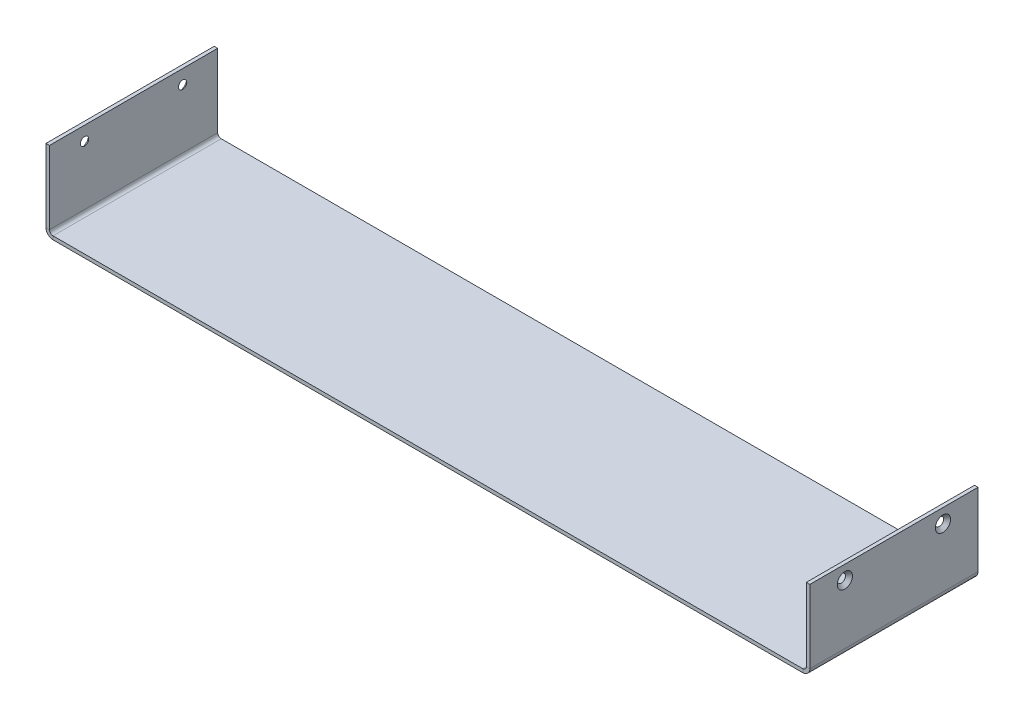
ISO-10303-21;
HEADER;
FILE_DESCRIPTION(('STEP AP214'),'2;1');
FILE_NAME('part.step','',(''),(''),'','','');
FILE_SCHEMA(('AUTOMOTIVE_DESIGN { 1 0 10303 214 1 1 1 1 }'));
ENDSEC;
DATA;
#1=APPLICATION_CONTEXT('core data for automotive mechanical design processes');
#2=APPLICATION_PROTOCOL_DEFINITION('international standard','automotive_design',2000,#1);
#3=PRODUCT_CONTEXT('',#1,'mechanical');
#4=PRODUCT('Part','Part','',(#3));
#5=PRODUCT_RELATED_PRODUCT_CATEGORY('part','',(#4));
#6=PRODUCT_DEFINITION_FORMATION('','',#4);
#7=PRODUCT_DEFINITION_CONTEXT('part definition',#1,'design');
#8=PRODUCT_DEFINITION('design','',#6,#7);
#9=PRODUCT_DEFINITION_SHAPE('','',#8);
#10=(LENGTH_UNIT() NAMED_UNIT(*) SI_UNIT(.MILLI.,.METRE.));
#11=(NAMED_UNIT(*) PLANE_ANGLE_UNIT() SI_UNIT($,.RADIAN.));
#12=(NAMED_UNIT(*) SI_UNIT($,.STERADIAN.) SOLID_ANGLE_UNIT());
#13=UNCERTAINTY_MEASURE_WITH_UNIT(LENGTH_MEASURE(1.E-05),#10,'distance_accuracy_value','');
#14=(GEOMETRIC_REPRESENTATION_CONTEXT(3) GLOBAL_UNCERTAINTY_ASSIGNED_CONTEXT((#13)) GLOBAL_UNIT_ASSIGNED_CONTEXT((#10,
#11,#12)) REPRESENTATION_CONTEXT('',''));
#15=CARTESIAN_POINT('',(0.,0.,0.));
#16=DIRECTION('',(0.,0.,1.));
#17=DIRECTION('',(1.,0.,0.));
#18=AXIS2_PLACEMENT_3D('',#15,#16,#17);
#19=CARTESIAN_POINT('',(0.,-41.7,96.));
#20=DIRECTION('',(0.,0.,1.));
#21=DIRECTION('',(1.,0.,0.));
#22=AXIS2_PLACEMENT_3D('',#19,#20,#21);
#23=PLANE('',#22);
#24=DIRECTION('',(1.,0.,0.));
#25=VECTOR('',#24,1.);
#26=CARTESIAN_POINT('',(0.,-41.7,96.));
#27=LINE('',#26,#25);
#28=CARTESIAN_POINT('',(0.,-41.7,96.));
#29=VERTEX_POINT('',#28);
#30=CARTESIAN_POINT('',(2.00000000000001,-41.7,96.));
#31=VERTEX_POINT('',#30);
#32=EDGE_CURVE('E150',#29,#31,#27,.T.);
#33=ORIENTED_EDGE('',*,*,#32,.F.);
#34=CARTESIAN_POINT('',(4.00000000000001,-41.7,96.));
#35=DIRECTION('',(0.,0.,-1.));
#36=DIRECTION('',(-1.,0.,0.));
#37=AXIS2_PLACEMENT_3D('',#34,#35,#36);
#38=CIRCLE('',#37,4.);
#39=CARTESIAN_POINT('',(4.00000000000001,-45.7,96.));
#40=VERTEX_POINT('',#39);
#41=EDGE_CURVE('E154',#29,#40,#38,.F.);
#42=ORIENTED_EDGE('',*,*,#41,.T.);
#43=DIRECTION('',(0.,-1.,0.));
#44=VECTOR('',#43,1.);
#45=CARTESIAN_POINT('',(4.00000000000001,-43.7,96.));
#46=LINE('',#45,#44);
#47=CARTESIAN_POINT('',(4.00000000000001,-43.7,96.));
#48=VERTEX_POINT('',#47);
#49=EDGE_CURVE('E138',#48,#40,#46,.T.);
#50=ORIENTED_EDGE('',*,*,#49,.F.);
#51=CARTESIAN_POINT('',(4.00000000000001,-41.7,96.));
#52=DIRECTION('',(0.,0.,1.));
#53=DIRECTION('',(1.,0.,0.));
#54=AXIS2_PLACEMENT_3D('',#51,#52,#53);
#55=CIRCLE('',#54,2.);
#56=EDGE_CURVE('E295',#31,#48,#55,.T.);
#57=ORIENTED_EDGE('',*,*,#56,.F.);
#58=EDGE_LOOP('',(#33,#42,#50,#57));
#59=FACE_BOUND('',#58,.T.);
#60=ADVANCED_FACE('F39',(#59),#23,.T.);
#61=CARTESIAN_POINT('',(4.00000000000001,-43.7,96.));
#62=DIRECTION('',(0.,0.,1.));
#63=DIRECTION('',(1.,0.,0.));
#64=AXIS2_PLACEMENT_3D('',#61,#62,#63);
#65=PLANE('',#64);
#66=DIRECTION('',(0.,-1.,0.));
#67=VECTOR('',#66,1.);
#68=CARTESIAN_POINT('',(0.,0.,96.));
#69=LINE('',#68,#67);
#70=CARTESIAN_POINT('',(0.,0.,96.));
#71=VERTEX_POINT('',#70);
#72=EDGE_CURVE('E159',#71,#29,#69,.T.);
#73=ORIENTED_EDGE('',*,*,#72,.T.);
#74=ORIENTED_EDGE('',*,*,#32,.T.);
#75=DIRECTION('',(0.,-1.,0.));
#76=VECTOR('',#75,1.);
#77=CARTESIAN_POINT('',(2.,0.,96.));
#78=LINE('',#77,#76);
#79=CARTESIAN_POINT('',(2.,0.,96.));
#80=VERTEX_POINT('',#79);
#81=EDGE_CURVE('E293',#80,#31,#78,.T.);
#82=ORIENTED_EDGE('',*,*,#81,.F.);
#83=DIRECTION('',(1.,0.,0.));
#84=VECTOR('',#83,1.);
#85=CARTESIAN_POINT('',(0.,0.,96.));
#86=LINE('',#85,#84);
#87=EDGE_CURVE('E291',#71,#80,#86,.T.);
#88=ORIENTED_EDGE('',*,*,#87,.F.);
#89=EDGE_LOOP('',(#73,#74,#82,#88));
#90=FACE_BOUND('',#89,.T.);
#91=ADVANCED_FACE('F328',(#90),#65,.T.);
#92=CARTESIAN_POINT('',(4.00000000000001,-45.7,0.));
#93=DIRECTION('',(0.,0.,-1.));
#94=DIRECTION('',(-1.,0.,0.));
#95=AXIS2_PLACEMENT_3D('',#92,#93,#94);
#96=PLANE('',#95);
#97=DIRECTION('',(0.,1.,0.));
#98=VECTOR('',#97,1.);
#99=CARTESIAN_POINT('',(4.00000000000001,-45.7,0.));
#100=LINE('',#99,#98);
#101=CARTESIAN_POINT('',(4.00000000000001,-45.7,0.));
#102=VERTEX_POINT('',#101);
#103=CARTESIAN_POINT('',(4.00000000000001,-43.7,0.));
#104=VERTEX_POINT('',#103);
#105=EDGE_CURVE('E151',#102,#104,#100,.T.);
#106=ORIENTED_EDGE('',*,*,#105,.F.);
#107=CARTESIAN_POINT('',(4.00000000000001,-41.7,0.));
#108=DIRECTION('',(0.,0.,-1.));
#109=DIRECTION('',(-1.,0.,0.));
#110=AXIS2_PLACEMENT_3D('',#107,#108,#109);
#111=CIRCLE('',#110,4.);
#112=CARTESIAN_POINT('',(0.,-41.7,0.));
#113=VERTEX_POINT('',#112);
#114=EDGE_CURVE('E166',#113,#102,#111,.F.);
#115=ORIENTED_EDGE('',*,*,#114,.F.);
#116=DIRECTION('',(-1.,0.,0.));
#117=VECTOR('',#116,1.);
#118=CARTESIAN_POINT('',(2.00000000000001,-41.7,0.));
#119=LINE('',#118,#117);
#120=CARTESIAN_POINT('',(2.00000000000001,-41.7,0.));
#121=VERTEX_POINT('',#120);
#122=EDGE_CURVE('E239',#121,#113,#119,.T.);
#123=ORIENTED_EDGE('',*,*,#122,.F.);
#124=CARTESIAN_POINT('',(4.00000000000001,-41.7,0.));
#125=DIRECTION('',(0.,0.,1.));
#126=DIRECTION('',(1.,0.,0.));
#127=AXIS2_PLACEMENT_3D('',#124,#125,#126);
#128=CIRCLE('',#127,2.);
#129=EDGE_CURVE('E193',#121,#104,#128,.T.);
#130=ORIENTED_EDGE('',*,*,#129,.T.);
#131=EDGE_LOOP('',(#106,#115,#123,#130));
#132=FACE_BOUND('',#131,.T.);
#133=ADVANCED_FACE('F331',(#132),#96,.T.);
#134=CARTESIAN_POINT('',(2.00000000000001,-41.7,0.));
#135=DIRECTION('',(0.,0.,-1.));
#136=DIRECTION('',(-1.,0.,0.));
#137=AXIS2_PLACEMENT_3D('',#134,#135,#136);
#138=PLANE('',#137);
#139=DIRECTION('',(1.,0.,0.));
#140=VECTOR('',#139,1.);
#141=CARTESIAN_POINT('',(0.,-45.7,0.));
#142=LINE('',#141,#140);
#143=CARTESIAN_POINT('',(432.,-45.7,0.));
#144=VERTEX_POINT('',#143);
#145=EDGE_CURVE('E206',#102,#144,#142,.T.);
#146=ORIENTED_EDGE('',*,*,#145,.F.);
#147=ORIENTED_EDGE('',*,*,#105,.T.);
#148=DIRECTION('',(1.,0.,0.));
#149=VECTOR('',#148,1.);
#150=CARTESIAN_POINT('',(0.,-43.7,0.));
#151=LINE('',#150,#149);
#152=CARTESIAN_POINT('',(432.,-43.7,0.));
#153=VERTEX_POINT('',#152);
#154=EDGE_CURVE('E191',#104,#153,#151,.T.);
#155=ORIENTED_EDGE('',*,*,#154,.T.);
#156=DIRECTION('',(0.,-1.,0.));
#157=VECTOR('',#156,1.);
#158=CARTESIAN_POINT('',(432.,-43.7,0.));
#159=LINE('',#158,#157);
#160=EDGE_CURVE('E97',#153,#144,#159,.T.);
#161=ORIENTED_EDGE('',*,*,#160,.T.);
#162=EDGE_LOOP('',(#146,#147,#155,#161));
#163=FACE_BOUND('',#162,.T.);
#164=ADVANCED_FACE('F332',(#163),#138,.T.);
#165=CARTESIAN_POINT('',(432.,-45.7,96.));
#166=DIRECTION('',(0.,0.,1.));
#167=DIRECTION('',(1.,0.,0.));
#168=AXIS2_PLACEMENT_3D('',#165,#166,#167);
#169=PLANE('',#168);
#170=DIRECTION('',(0.,1.,0.));
#171=VECTOR('',#170,1.);
#172=CARTESIAN_POINT('',(432.,-45.7,96.));
#173=LINE('',#172,#171);
#174=CARTESIAN_POINT('',(432.,-45.7,96.));
#175=VERTEX_POINT('',#174);
#176=CARTESIAN_POINT('',(432.,-43.7,96.));
#177=VERTEX_POINT('',#176);
#178=EDGE_CURVE('E237',#175,#177,#173,.T.);
#179=ORIENTED_EDGE('',*,*,#178,.F.);
#180=CARTESIAN_POINT('',(432.,-41.7,96.));
#181=DIRECTION('',(0.,0.,-1.));
#182=DIRECTION('',(-1.,0.,0.));
#183=AXIS2_PLACEMENT_3D('',#180,#181,#182);
#184=CIRCLE('',#183,4.);
#185=CARTESIAN_POINT('',(436.,-41.7,96.));
#186=VERTEX_POINT('',#185);
#187=EDGE_CURVE('E174',#175,#186,#184,.F.);
#188=ORIENTED_EDGE('',*,*,#187,.T.);
#189=DIRECTION('',(1.,0.,0.));
#190=VECTOR('',#189,1.);
#191=CARTESIAN_POINT('',(434.,-41.7,96.));
#192=LINE('',#191,#190);
#193=CARTESIAN_POINT('',(434.,-41.7,96.));
#194=VERTEX_POINT('',#193);
#195=EDGE_CURVE('E56',#194,#186,#192,.T.);
#196=ORIENTED_EDGE('',*,*,#195,.F.);
#197=CARTESIAN_POINT('',(432.,-41.7,96.));
#198=DIRECTION('',(0.,0.,1.));
#199=DIRECTION('',(1.,0.,0.));
#200=AXIS2_PLACEMENT_3D('',#197,#198,#199);
#201=CIRCLE('',#200,2.);
#202=EDGE_CURVE('E300',#177,#194,#201,.T.);
#203=ORIENTED_EDGE('',*,*,#202,.F.);
#204=EDGE_LOOP('',(#179,#188,#196,#203));
#205=FACE_BOUND('',#204,.T.);
#206=ADVANCED_FACE('F323',(#205),#169,.T.);
#207=CARTESIAN_POINT('',(434.,-41.7,96.));
#208=DIRECTION('',(0.,0.,1.));
#209=DIRECTION('',(1.,0.,0.));
#210=AXIS2_PLACEMENT_3D('',#207,#208,#209);
#211=PLANE('',#210);
#212=DIRECTION('',(1.,0.,0.));
#213=VECTOR('',#212,1.);
#214=CARTESIAN_POINT('',(0.,-45.7,96.));
#215=LINE('',#214,#213);
#216=EDGE_CURVE('E142',#40,#175,#215,.T.);
#217=ORIENTED_EDGE('',*,*,#216,.T.);
#218=ORIENTED_EDGE('',*,*,#178,.T.);
#219=DIRECTION('',(1.,0.,0.));
#220=VECTOR('',#219,1.);
#221=CARTESIAN_POINT('',(0.,-43.7,96.));
#222=LINE('',#221,#220);
#223=EDGE_CURVE('E145',#48,#177,#222,.T.);
#224=ORIENTED_EDGE('',*,*,#223,.F.);
#225=ORIENTED_EDGE('',*,*,#49,.T.);
#226=EDGE_LOOP('',(#217,#218,#224,#225));
#227=FACE_BOUND('',#226,.T.);
#228=ADVANCED_FACE('F140',(#227),#211,.T.);
#229=CARTESIAN_POINT('',(436.,-41.7,0.));
#230=DIRECTION('',(0.,0.,-1.));
#231=DIRECTION('',(-1.,0.,0.));
#232=AXIS2_PLACEMENT_3D('',#229,#230,#231);
#233=PLANE('',#232);
#234=DIRECTION('',(-1.,0.,0.));
#235=VECTOR('',#234,1.);
#236=CARTESIAN_POINT('',(436.,-41.7,0.));
#237=LINE('',#236,#235);
#238=CARTESIAN_POINT('',(436.,-41.7,0.));
#239=VERTEX_POINT('',#238);
#240=CARTESIAN_POINT('',(434.,-41.7,0.));
#241=VERTEX_POINT('',#240);
#242=EDGE_CURVE('E104',#239,#241,#237,.T.);
#243=ORIENTED_EDGE('',*,*,#242,.F.);
#244=CARTESIAN_POINT('',(432.,-41.7,0.));
#245=DIRECTION('',(0.,0.,-1.));
#246=DIRECTION('',(-1.,0.,0.));
#247=AXIS2_PLACEMENT_3D('',#244,#245,#246);
#248=CIRCLE('',#247,4.);
#249=EDGE_CURVE('E208',#144,#239,#248,.F.);
#250=ORIENTED_EDGE('',*,*,#249,.F.);
#251=ORIENTED_EDGE('',*,*,#160,.F.);
#252=CARTESIAN_POINT('',(432.,-41.7,0.));
#253=DIRECTION('',(0.,0.,1.));
#254=DIRECTION('',(1.,0.,0.));
#255=AXIS2_PLACEMENT_3D('',#252,#253,#254);
#256=CIRCLE('',#255,2.);
#257=EDGE_CURVE('E189',#153,#241,#256,.T.);
#258=ORIENTED_EDGE('',*,*,#257,.T.);
#259=EDGE_LOOP('',(#243,#250,#251,#258));
#260=FACE_BOUND('',#259,.T.);
#261=ADVANCED_FACE('F336',(#260),#233,.T.);
#262=CARTESIAN_POINT('',(432.,-43.7,0.));
#263=DIRECTION('',(0.,0.,-1.));
#264=DIRECTION('',(-1.,0.,0.));
#265=AXIS2_PLACEMENT_3D('',#262,#263,#264);
#266=PLANE('',#265);
#267=DIRECTION('',(0.,1.,0.));
#268=VECTOR('',#267,1.);
#269=CARTESIAN_POINT('',(436.,-45.7,0.));
#270=LINE('',#269,#268);
#271=CARTESIAN_POINT('',(436.,0.,0.));
#272=VERTEX_POINT('',#271);
#273=EDGE_CURVE('E180',#239,#272,#270,.T.);
#274=ORIENTED_EDGE('',*,*,#273,.F.);
#275=ORIENTED_EDGE('',*,*,#242,.T.);
#276=DIRECTION('',(0.,1.,0.));
#277=VECTOR('',#276,1.);
#278=CARTESIAN_POINT('',(434.,-45.7,0.));
#279=LINE('',#278,#277);
#280=CARTESIAN_POINT('',(434.,0.,0.));
#281=VERTEX_POINT('',#280);
#282=EDGE_CURVE('E186',#241,#281,#279,.T.);
#283=ORIENTED_EDGE('',*,*,#282,.T.);
#284=DIRECTION('',(1.,0.,0.));
#285=VECTOR('',#284,1.);
#286=CARTESIAN_POINT('',(434.,0.,0.));
#287=LINE('',#286,#285);
#288=EDGE_CURVE('E183',#281,#272,#287,.T.);
#289=ORIENTED_EDGE('',*,*,#288,.T.);
#290=EDGE_LOOP('',(#274,#275,#283,#289));
#291=FACE_BOUND('',#290,.T.);
#292=ADVANCED_FACE('F338',(#291),#266,.T.);
#293=CARTESIAN_POINT('',(436.,-45.7,96.));
#294=DIRECTION('',(-1.,0.,0.));
#295=DIRECTION('',(0.,0.,1.));
#296=AXIS2_PLACEMENT_3D('',#293,#294,#295);
#297=PLANE('',#296);
#298=CARTESIAN_POINT('',(436.,-7.99999999999995,20.));
#299=DIRECTION('',(-1.,0.,0.));
#300=DIRECTION('',(0.,0.,1.));
#301=AXIS2_PLACEMENT_3D('',#298,#299,#300);
#302=CIRCLE('',#301,4.35000000000003);
#303=CARTESIAN_POINT('',(436.,-7.99999999999995,15.6499999999999));
#304=VERTEX_POINT('',#303);
#305=EDGE_CURVE('E246',#304,#304,#302,.T.);
#306=ORIENTED_EDGE('',*,*,#305,.T.);
#307=EDGE_LOOP('',(#306));
#308=FACE_BOUND('',#307,.T.);
#309=CARTESIAN_POINT('',(436.,-7.99999999999995,76.));
#310=DIRECTION('',(-1.,0.,0.));
#311=DIRECTION('',(0.,0.,1.));
#312=AXIS2_PLACEMENT_3D('',#309,#310,#311);
#313=CIRCLE('',#312,4.35000000000003);
#314=CARTESIAN_POINT('',(436.,-7.99999999999995,71.6499999999999));
#315=VERTEX_POINT('',#314);
#316=EDGE_CURVE('E243',#315,#315,#313,.T.);
#317=ORIENTED_EDGE('',*,*,#316,.T.);
#318=EDGE_LOOP('',(#317));
#319=FACE_BOUND('',#318,.T.);
#320=ORIENTED_EDGE('',*,*,#273,.T.);
#321=DIRECTION('',(0.,0.,-1.));
#322=VECTOR('',#321,1.);
#323=CARTESIAN_POINT('',(436.,0.,96.));
#324=LINE('',#323,#322);
#325=CARTESIAN_POINT('',(436.,0.,96.));
#326=VERTEX_POINT('',#325);
#327=EDGE_CURVE('E232',#326,#272,#324,.T.);
#328=ORIENTED_EDGE('',*,*,#327,.F.);
#329=DIRECTION('',(0.,1.,0.));
#330=VECTOR('',#329,1.);
#331=CARTESIAN_POINT('',(436.,-45.7,96.));
#332=LINE('',#331,#330);
#333=EDGE_CURVE('E110',#186,#326,#332,.T.);
#334=ORIENTED_EDGE('',*,*,#333,.F.);
#335=DIRECTION('',(0.,0.,-1.));
#336=VECTOR('',#335,1.);
#337=CARTESIAN_POINT('',(436.,-41.7,96.));
#338=LINE('',#337,#336);
#339=EDGE_CURVE('E176',#186,#239,#338,.T.);
#340=ORIENTED_EDGE('',*,*,#339,.T.);
#341=EDGE_LOOP('',(#320,#328,#334,#340));
#342=FACE_BOUND('',#341,.T.);
#343=ADVANCED_FACE('F344',(#308,#319,#342),#297,.F.);
#344=CARTESIAN_POINT('',(434.,0.,96.));
#345=DIRECTION('',(0.,1.,0.));
#346=DIRECTION('',(0.,0.,1.));
#347=AXIS2_PLACEMENT_3D('',#344,#345,#346);
#348=PLANE('',#347);
#349=ORIENTED_EDGE('',*,*,#288,.F.);
#350=DIRECTION('',(0.,0.,-1.));
#351=VECTOR('',#350,1.);
#352=CARTESIAN_POINT('',(434.,0.,96.));
#353=LINE('',#352,#351);
#354=CARTESIAN_POINT('',(434.,0.,96.));
#355=VERTEX_POINT('',#354);
#356=EDGE_CURVE('E230',#355,#281,#353,.T.);
#357=ORIENTED_EDGE('',*,*,#356,.F.);
#358=DIRECTION('',(1.,0.,0.));
#359=VECTOR('',#358,1.);
#360=CARTESIAN_POINT('',(434.,0.,96.));
#361=LINE('',#360,#359);
#362=EDGE_CURVE('E306',#355,#326,#361,.T.);
#363=ORIENTED_EDGE('',*,*,#362,.T.);
#364=ORIENTED_EDGE('',*,*,#327,.T.);
#365=EDGE_LOOP('',(#349,#357,#363,#364));
#366=FACE_BOUND('',#365,.T.);
#367=ADVANCED_FACE('F311',(#366),#348,.T.);
#368=CARTESIAN_POINT('',(434.,-45.7,96.));
#369=DIRECTION('',(-1.,0.,0.));
#370=DIRECTION('',(0.,0.,1.));
#371=AXIS2_PLACEMENT_3D('',#368,#369,#370);
#372=PLANE('',#371);
#373=CARTESIAN_POINT('',(434.,-7.99999999999995,20.));
#374=DIRECTION('',(-1.,0.,0.));
#375=DIRECTION('',(0.,0.,1.));
#376=AXIS2_PLACEMENT_3D('',#373,#374,#375);
#377=CIRCLE('',#376,2.34999999999999);
#378=CARTESIAN_POINT('',(434.,-7.99999999999995,17.65));
#379=VERTEX_POINT('',#378);
#380=EDGE_CURVE('E252',#379,#379,#377,.F.);
#381=ORIENTED_EDGE('',*,*,#380,.T.);
#382=EDGE_LOOP('',(#381));
#383=FACE_BOUND('',#382,.T.);
#384=CARTESIAN_POINT('',(434.,-7.99999999999995,76.));
#385=DIRECTION('',(-1.,0.,0.));
#386=DIRECTION('',(0.,0.,1.));
#387=AXIS2_PLACEMENT_3D('',#384,#385,#386);
#388=CIRCLE('',#387,2.34999999999999);
#389=CARTESIAN_POINT('',(434.,-7.99999999999995,73.65));
#390=VERTEX_POINT('',#389);
#391=EDGE_CURVE('E249',#390,#390,#388,.F.);
#392=ORIENTED_EDGE('',*,*,#391,.T.);
#393=EDGE_LOOP('',(#392));
#394=FACE_BOUND('',#393,.T.);
#395=ORIENTED_EDGE('',*,*,#282,.F.);
#396=DIRECTION('',(0.,0.,-1.));
#397=VECTOR('',#396,1.);
#398=CARTESIAN_POINT('',(434.,-41.7,96.));
#399=LINE('',#398,#397);
#400=EDGE_CURVE('E227',#194,#241,#399,.T.);
#401=ORIENTED_EDGE('',*,*,#400,.F.);
#402=DIRECTION('',(0.,1.,0.));
#403=VECTOR('',#402,1.);
#404=CARTESIAN_POINT('',(434.,-45.7,96.));
#405=LINE('',#404,#403);
#406=EDGE_CURVE('E303',#194,#355,#405,.T.);
#407=ORIENTED_EDGE('',*,*,#406,.T.);
#408=ORIENTED_EDGE('',*,*,#356,.T.);
#409=EDGE_LOOP('',(#395,#401,#407,#408));
#410=FACE_BOUND('',#409,.T.);
#411=ADVANCED_FACE('F316',(#383,#394,#410),#372,.T.);
#412=CARTESIAN_POINT('',(432.,-41.7,96.));
#413=DIRECTION('',(0.,0.,-1.));
#414=DIRECTION('',(-1.,0.,0.));
#415=AXIS2_PLACEMENT_3D('',#412,#413,#414);
#416=CYLINDRICAL_SURFACE('',#415,2.);
#417=ORIENTED_EDGE('',*,*,#257,.F.);
#418=DIRECTION('',(0.,0.,-1.));
#419=VECTOR('',#418,1.);
#420=CARTESIAN_POINT('',(432.,-43.7,96.));
#421=LINE('',#420,#419);
#422=EDGE_CURVE('E224',#177,#153,#421,.T.);
#423=ORIENTED_EDGE('',*,*,#422,.F.);
#424=ORIENTED_EDGE('',*,*,#202,.T.);
#425=ORIENTED_EDGE('',*,*,#400,.T.);
#426=EDGE_LOOP('',(#417,#423,#424,#425));
#427=FACE_BOUND('',#426,.T.);
#428=ADVANCED_FACE('F319',(#427),#416,.F.);
#429=CARTESIAN_POINT('',(0.,-43.7,96.));
#430=DIRECTION('',(0.,1.,0.));
#431=DIRECTION('',(0.,0.,1.));
#432=AXIS2_PLACEMENT_3D('',#429,#430,#431);
#433=PLANE('',#432);
#434=ORIENTED_EDGE('',*,*,#154,.F.);
#435=DIRECTION('',(0.,0.,-1.));
#436=VECTOR('',#435,1.);
#437=CARTESIAN_POINT('',(4.00000000000001,-43.7,96.));
#438=LINE('',#437,#436);
#439=EDGE_CURVE('E221',#48,#104,#438,.T.);
#440=ORIENTED_EDGE('',*,*,#439,.F.);
#441=ORIENTED_EDGE('',*,*,#223,.T.);
#442=ORIENTED_EDGE('',*,*,#422,.T.);
#443=EDGE_LOOP('',(#434,#440,#441,#442));
#444=FACE_BOUND('',#443,.T.);
#445=ADVANCED_FACE('F326',(#444),#433,.T.);
#446=CARTESIAN_POINT('',(4.00000000000001,-41.7,96.));
#447=DIRECTION('',(0.,0.,-1.));
#448=DIRECTION('',(-1.,0.,0.));
#449=AXIS2_PLACEMENT_3D('',#446,#447,#448);
#450=CYLINDRICAL_SURFACE('',#449,2.);
#451=ORIENTED_EDGE('',*,*,#129,.F.);
#452=DIRECTION('',(0.,0.,-1.));
#453=VECTOR('',#452,1.);
#454=CARTESIAN_POINT('',(2.00000000000001,-41.7,96.));
#455=LINE('',#454,#453);
#456=EDGE_CURVE('E218',#31,#121,#455,.T.);
#457=ORIENTED_EDGE('',*,*,#456,.F.);
#458=ORIENTED_EDGE('',*,*,#56,.T.);
#459=ORIENTED_EDGE('',*,*,#439,.T.);
#460=EDGE_LOOP('',(#451,#457,#458,#459));
#461=FACE_BOUND('',#460,.T.);
#462=ADVANCED_FACE('F275',(#461),#450,.F.);
#463=CARTESIAN_POINT('',(2.,0.,96.));
#464=DIRECTION('',(1.,0.,0.));
#465=DIRECTION('',(0.,1.,0.));
#466=AXIS2_PLACEMENT_3D('',#463,#464,#465);
#467=PLANE('',#466);
#468=CARTESIAN_POINT('',(2.,-8.,76.));
#469=DIRECTION('',(1.,0.,0.));
#470=DIRECTION('',(0.,1.,0.));
#471=AXIS2_PLACEMENT_3D('',#468,#469,#470);
#472=CIRCLE('',#471,2.35000000000004);
#473=CARTESIAN_POINT('',(2.,-5.64999999999996,76.));
#474=VERTEX_POINT('',#473);
#475=EDGE_CURVE('E258',#474,#474,#472,.F.);
#476=ORIENTED_EDGE('',*,*,#475,.T.);
#477=EDGE_LOOP('',(#476));
#478=FACE_BOUND('',#477,.T.);
#479=CARTESIAN_POINT('',(2.,-8.,20.));
#480=DIRECTION('',(1.,0.,0.));
#481=DIRECTION('',(0.,1.,0.));
#482=AXIS2_PLACEMENT_3D('',#479,#480,#481);
#483=CIRCLE('',#482,2.35000000000005);
#484=CARTESIAN_POINT('',(2.,-5.64999999999995,20.));
#485=VERTEX_POINT('',#484);
#486=EDGE_CURVE('E255',#485,#485,#483,.F.);
#487=ORIENTED_EDGE('',*,*,#486,.T.);
#488=EDGE_LOOP('',(#487));
#489=FACE_BOUND('',#488,.T.);
#490=DIRECTION('',(0.,-1.,0.));
#491=VECTOR('',#490,1.);
#492=CARTESIAN_POINT('',(2.,0.,0.));
#493=LINE('',#492,#491);
#494=CARTESIAN_POINT('',(2.,0.,0.));
#495=VERTEX_POINT('',#494);
#496=EDGE_CURVE('E196',#495,#121,#493,.T.);
#497=ORIENTED_EDGE('',*,*,#496,.F.);
#498=DIRECTION('',(0.,0.,-1.));
#499=VECTOR('',#498,1.);
#500=CARTESIAN_POINT('',(2.,0.,96.));
#501=LINE('',#500,#499);
#502=EDGE_CURVE('E216',#80,#495,#501,.T.);
#503=ORIENTED_EDGE('',*,*,#502,.F.);
#504=ORIENTED_EDGE('',*,*,#81,.T.);
#505=ORIENTED_EDGE('',*,*,#456,.T.);
#506=EDGE_LOOP('',(#497,#503,#504,#505));
#507=FACE_BOUND('',#506,.T.);
#508=ADVANCED_FACE('F271',(#478,#489,#507),#467,.T.);
#509=CARTESIAN_POINT('',(0.,0.,96.));
#510=DIRECTION('',(0.,1.,0.));
#511=DIRECTION('',(-1.,0.,0.));
#512=AXIS2_PLACEMENT_3D('',#509,#510,#511);
#513=PLANE('',#512);
#514=DIRECTION('',(1.,0.,0.));
#515=VECTOR('',#514,1.);
#516=CARTESIAN_POINT('',(0.,0.,0.));
#517=LINE('',#516,#515);
#518=CARTESIAN_POINT('',(0.,0.,0.));
#519=VERTEX_POINT('',#518);
#520=EDGE_CURVE('E199',#519,#495,#517,.T.);
#521=ORIENTED_EDGE('',*,*,#520,.F.);
#522=DIRECTION('',(0.,0.,-1.));
#523=VECTOR('',#522,1.);
#524=CARTESIAN_POINT('',(0.,0.,96.));
#525=LINE('',#524,#523);
#526=EDGE_CURVE('E214',#71,#519,#525,.T.);
#527=ORIENTED_EDGE('',*,*,#526,.F.);
#528=ORIENTED_EDGE('',*,*,#87,.T.);
#529=ORIENTED_EDGE('',*,*,#502,.T.);
#530=EDGE_LOOP('',(#521,#527,#528,#529));
#531=FACE_BOUND('',#530,.T.);
#532=ADVANCED_FACE('F274',(#531),#513,.T.);
#533=CARTESIAN_POINT('',(0.,0.,96.));
#534=DIRECTION('',(1.,0.,0.));
#535=DIRECTION('',(0.,1.,0.));
#536=AXIS2_PLACEMENT_3D('',#533,#534,#535);
#537=PLANE('',#536);
#538=CARTESIAN_POINT('',(0.,-8.,76.));
#539=DIRECTION('',(1.,0.,0.));
#540=DIRECTION('',(0.,1.,0.));
#541=AXIS2_PLACEMENT_3D('',#538,#539,#540);
#542=CIRCLE('',#541,4.35);
#543=CARTESIAN_POINT('',(0.,-3.65,76.));
#544=VERTEX_POINT('',#543);
#545=EDGE_CURVE('E11',#544,#544,#542,.T.);
#546=ORIENTED_EDGE('',*,*,#545,.T.);
#547=EDGE_LOOP('',(#546));
#548=FACE_BOUND('',#547,.T.);
#549=CARTESIAN_POINT('',(0.,-8.,20.));
#550=DIRECTION('',(1.,0.,0.));
#551=DIRECTION('',(0.,1.,0.));
#552=AXIS2_PLACEMENT_3D('',#549,#550,#551);
#553=CIRCLE('',#552,4.35000000000001);
#554=CARTESIAN_POINT('',(0.,-3.64999999999999,20.));
#555=VERTEX_POINT('',#554);
#556=EDGE_CURVE('E48',#555,#555,#553,.T.);
#557=ORIENTED_EDGE('',*,*,#556,.T.);
#558=EDGE_LOOP('',(#557));
#559=FACE_BOUND('',#558,.T.);
#560=DIRECTION('',(0.,-1.,0.));
#561=VECTOR('',#560,1.);
#562=CARTESIAN_POINT('',(0.,0.,0.));
#563=LINE('',#562,#561);
#564=EDGE_CURVE('E202',#519,#113,#563,.T.);
#565=ORIENTED_EDGE('',*,*,#564,.T.);
#566=DIRECTION('',(0.,0.,-1.));
#567=VECTOR('',#566,1.);
#568=CARTESIAN_POINT('',(0.,-41.7,96.));
#569=LINE('',#568,#567);
#570=EDGE_CURVE('E168',#29,#113,#569,.T.);
#571=ORIENTED_EDGE('',*,*,#570,.F.);
#572=ORIENTED_EDGE('',*,*,#72,.F.);
#573=ORIENTED_EDGE('',*,*,#526,.T.);
#574=EDGE_LOOP('',(#565,#571,#572,#573));
#575=FACE_BOUND('',#574,.T.);
#576=ADVANCED_FACE('F263',(#548,#559,#575),#537,.F.);
#577=CARTESIAN_POINT('',(4.00000000000001,-41.7,96.));
#578=DIRECTION('',(0.,0.,-1.));
#579=DIRECTION('',(-1.,0.,0.));
#580=AXIS2_PLACEMENT_3D('',#577,#578,#579);
#581=CYLINDRICAL_SURFACE('',#580,4.);
#582=ORIENTED_EDGE('',*,*,#114,.T.);
#583=DIRECTION('',(0.,0.,-1.));
#584=VECTOR('',#583,1.);
#585=CARTESIAN_POINT('',(4.00000000000001,-45.7,96.));
#586=LINE('',#585,#584);
#587=EDGE_CURVE('E163',#40,#102,#586,.T.);
#588=ORIENTED_EDGE('',*,*,#587,.F.);
#589=ORIENTED_EDGE('',*,*,#41,.F.);
#590=ORIENTED_EDGE('',*,*,#570,.T.);
#591=EDGE_LOOP('',(#582,#588,#589,#590));
#592=FACE_BOUND('',#591,.T.);
#593=ADVANCED_FACE('F164',(#592),#581,.T.);
#594=CARTESIAN_POINT('',(0.,-45.7,96.));
#595=DIRECTION('',(0.,1.,0.));
#596=DIRECTION('',(0.,0.,1.));
#597=AXIS2_PLACEMENT_3D('',#594,#595,#596);
#598=PLANE('',#597);
#599=ORIENTED_EDGE('',*,*,#145,.T.);
#600=DIRECTION('',(0.,0.,-1.));
#601=VECTOR('',#600,1.);
#602=CARTESIAN_POINT('',(432.,-45.7,96.));
#603=LINE('',#602,#601);
#604=EDGE_CURVE('E169',#175,#144,#603,.T.);
#605=ORIENTED_EDGE('',*,*,#604,.F.);
#606=ORIENTED_EDGE('',*,*,#216,.F.);
#607=ORIENTED_EDGE('',*,*,#587,.T.);
#608=EDGE_LOOP('',(#599,#605,#606,#607));
#609=FACE_BOUND('',#608,.T.);
#610=ADVANCED_FACE('F171',(#609),#598,.F.);
#611=CARTESIAN_POINT('',(432.,-41.7,96.));
#612=DIRECTION('',(0.,0.,-1.));
#613=DIRECTION('',(-1.,0.,0.));
#614=AXIS2_PLACEMENT_3D('',#611,#612,#613);
#615=CYLINDRICAL_SURFACE('',#614,4.);
#616=ORIENTED_EDGE('',*,*,#249,.T.);
#617=ORIENTED_EDGE('',*,*,#339,.F.);
#618=ORIENTED_EDGE('',*,*,#187,.F.);
#619=ORIENTED_EDGE('',*,*,#604,.T.);
#620=EDGE_LOOP('',(#616,#617,#618,#619));
#621=FACE_BOUND('',#620,.T.);
#622=ADVANCED_FACE('F334',(#621),#615,.T.);
#623=CARTESIAN_POINT('',(432.,-41.7,96.));
#624=DIRECTION('',(0.,0.,1.));
#625=DIRECTION('',(1.,0.,0.));
#626=AXIS2_PLACEMENT_3D('',#623,#624,#625);
#627=PLANE('',#626);
#628=ORIENTED_EDGE('',*,*,#333,.T.);
#629=ORIENTED_EDGE('',*,*,#362,.F.);
#630=ORIENTED_EDGE('',*,*,#406,.F.);
#631=ORIENTED_EDGE('',*,*,#195,.T.);
#632=EDGE_LOOP('',(#628,#629,#630,#631));
#633=FACE_BOUND('',#632,.T.);
#634=ADVANCED_FACE('F312',(#633),#627,.T.);
#635=CARTESIAN_POINT('',(432.,-41.7,0.));
#636=DIRECTION('',(0.,0.,1.));
#637=DIRECTION('',(1.,0.,0.));
#638=AXIS2_PLACEMENT_3D('',#635,#636,#637);
#639=PLANE('',#638);
#640=ORIENTED_EDGE('',*,*,#496,.T.);
#641=ORIENTED_EDGE('',*,*,#122,.T.);
#642=ORIENTED_EDGE('',*,*,#564,.F.);
#643=ORIENTED_EDGE('',*,*,#520,.T.);
#644=EDGE_LOOP('',(#640,#641,#642,#643));
#645=FACE_BOUND('',#644,.T.);
#646=ADVANCED_FACE('F286',(#645),#639,.F.);
#647=CARTESIAN_POINT('',(436.,-7.99999999999995,20.));
#648=DIRECTION('',(1.,0.,0.));
#649=DIRECTION('',(0.,0.,-1.));
#650=AXIS2_PLACEMENT_3D('',#647,#648,#649);
#651=CONICAL_SURFACE('',#650,4.35000000000003,0.785398163397458);
#652=CARTESIAN_POINT('',(434.,-7.99999999999995,17.65));
#653=CARTESIAN_POINT('',(434.020833333333,-7.99999999999995,17.6291666666666));
#654=CARTESIAN_POINT('',(434.041666666667,-7.99999999999995,17.6083333333333));
#655=CARTESIAN_POINT('',(434.083333333333,-7.99999999999995,17.5666666666666));
#656=CARTESIAN_POINT('',(434.104166666667,-7.99999999999995,17.5458333333333));
#657=CARTESIAN_POINT('',(434.145833333333,-7.99999999999995,17.5041666666666));
#658=CARTESIAN_POINT('',(434.166666666667,-7.99999999999995,17.4833333333333));
#659=CARTESIAN_POINT('',(434.208333333333,-7.99999999999995,17.4416666666666));
#660=CARTESIAN_POINT('',(434.229166666667,-7.99999999999995,17.4208333333333));
#661=CARTESIAN_POINT('',(434.270833333333,-7.99999999999995,17.3791666666666));
#662=CARTESIAN_POINT('',(434.291666666667,-7.99999999999995,17.3583333333333));
#663=CARTESIAN_POINT('',(434.333333333333,-7.99999999999995,17.3166666666666));
#664=CARTESIAN_POINT('',(434.354166666667,-7.99999999999995,17.2958333333333));
#665=CARTESIAN_POINT('',(434.395833333333,-7.99999999999995,17.2541666666666));
#666=CARTESIAN_POINT('',(434.416666666667,-7.99999999999995,17.2333333333333));
#667=CARTESIAN_POINT('',(434.458333333333,-7.99999999999995,17.1916666666666));
#668=CARTESIAN_POINT('',(434.479166666667,-7.99999999999995,17.1708333333333));
#669=CARTESIAN_POINT('',(434.520833333333,-7.99999999999995,17.1291666666666));
#670=CARTESIAN_POINT('',(434.541666666667,-7.99999999999995,17.1083333333333));
#671=CARTESIAN_POINT('',(434.583333333333,-7.99999999999995,17.0666666666666));
#672=CARTESIAN_POINT('',(434.604166666667,-7.99999999999995,17.0458333333333));
#673=CARTESIAN_POINT('',(434.645833333333,-7.99999999999995,17.0041666666666));
#674=CARTESIAN_POINT('',(434.666666666667,-7.99999999999995,16.9833333333333));
#675=CARTESIAN_POINT('',(434.708333333333,-7.99999999999995,16.9416666666666));
#676=CARTESIAN_POINT('',(434.729166666667,-7.99999999999995,16.9208333333333));
#677=CARTESIAN_POINT('',(434.770833333333,-7.99999999999995,16.8791666666666));
#678=CARTESIAN_POINT('',(434.791666666667,-7.99999999999995,16.8583333333333));
#679=CARTESIAN_POINT('',(434.833333333333,-7.99999999999995,16.8166666666666));
#680=CARTESIAN_POINT('',(434.854166666667,-7.99999999999995,16.7958333333333));
#681=CARTESIAN_POINT('',(434.895833333333,-7.99999999999995,16.7541666666666));
#682=CARTESIAN_POINT('',(434.916666666667,-7.99999999999995,16.7333333333333));
#683=CARTESIAN_POINT('',(434.958333333333,-7.99999999999995,16.6916666666666));
#684=CARTESIAN_POINT('',(434.979166666667,-7.99999999999995,16.6708333333333));
#685=CARTESIAN_POINT('',(435.020833333333,-7.99999999999995,16.6291666666666));
#686=CARTESIAN_POINT('',(435.041666666667,-7.99999999999995,16.6083333333333));
#687=CARTESIAN_POINT('',(435.083333333333,-7.99999999999995,16.5666666666666));
#688=CARTESIAN_POINT('',(435.104166666667,-7.99999999999995,16.5458333333333));
#689=CARTESIAN_POINT('',(435.145833333333,-7.99999999999995,16.5041666666666));
#690=CARTESIAN_POINT('',(435.166666666667,-7.99999999999995,16.4833333333333));
#691=CARTESIAN_POINT('',(435.208333333333,-7.99999999999995,16.4416666666666));
#692=CARTESIAN_POINT('',(435.229166666667,-7.99999999999995,16.4208333333333));
#693=CARTESIAN_POINT('',(435.270833333333,-7.99999999999995,16.3791666666666));
#694=CARTESIAN_POINT('',(435.291666666667,-7.99999999999995,16.3583333333333));
#695=CARTESIAN_POINT('',(435.333333333333,-7.99999999999995,16.3166666666666));
#696=CARTESIAN_POINT('',(435.354166666667,-7.99999999999995,16.2958333333333));
#697=CARTESIAN_POINT('',(435.395833333333,-7.99999999999995,16.2541666666666));
#698=CARTESIAN_POINT('',(435.416666666667,-7.99999999999995,16.2333333333333));
#699=CARTESIAN_POINT('',(435.458333333333,-7.99999999999995,16.1916666666666));
#700=CARTESIAN_POINT('',(435.479166666667,-7.99999999999995,16.1708333333333));
#701=CARTESIAN_POINT('',(435.520833333333,-7.99999999999995,16.1291666666666));
#702=CARTESIAN_POINT('',(435.541666666667,-7.99999999999995,16.1083333333333));
#703=CARTESIAN_POINT('',(435.583333333333,-7.99999999999995,16.0666666666666));
#704=CARTESIAN_POINT('',(435.604166666667,-7.99999999999995,16.0458333333333));
#705=CARTESIAN_POINT('',(435.645833333333,-7.99999999999995,16.0041666666666));
#706=CARTESIAN_POINT('',(435.666666666667,-7.99999999999995,15.9833333333333));
#707=CARTESIAN_POINT('',(435.708333333333,-7.99999999999995,15.9416666666666));
#708=CARTESIAN_POINT('',(435.729166666667,-7.99999999999995,15.9208333333333));
#709=CARTESIAN_POINT('',(435.770833333333,-7.99999999999995,15.8791666666666));
#710=CARTESIAN_POINT('',(435.791666666667,-7.99999999999995,15.8583333333333));
#711=CARTESIAN_POINT('',(435.833333333333,-7.99999999999995,15.8166666666666));
#712=CARTESIAN_POINT('',(435.854166666667,-7.99999999999995,15.7958333333333));
#713=CARTESIAN_POINT('',(435.895833333333,-7.99999999999995,15.7541666666666));
#714=CARTESIAN_POINT('',(435.916666666667,-7.99999999999995,15.7333333333333));
#715=CARTESIAN_POINT('',(435.958333333333,-7.99999999999995,15.6916666666666));
#716=CARTESIAN_POINT('',(435.979166666667,-7.99999999999995,15.6708333333333));
#717=CARTESIAN_POINT('',(436.,-7.99999999999995,15.6499999999999));
#718=B_SPLINE_CURVE_WITH_KNOTS('',3,(#652,#653,#654,#655,#656,#657,#658,#659,#660,#661,#662,
#663,#664,#665,#666,#667,#668,#669,#670,#671,#672,#673,#674,#675,#676,#677,#678,#679,#680,#681,
#682,#683,#684,#685,#686,#687,#688,#689,#690,#691,#692,#693,#694,#695,#696,#697,#698,#699,#700,
#701,#702,#703,#704,#705,#706,#707,#708,#709,#710,#711,#712,#713,#714,#715,#716,#717),
.UNSPECIFIED.,.F.,.F.,(4,2,2,2,2,2,2,2,2,2,2,2,2,2,2,2,2,2,2,2,2,2,2,2,2,2,2,2,2,2,2,2,4),(0.,
0.0883883476483332,0.176776695296666,0.265165042944963,0.353553390593296,0.441941738241632,
0.530330085889926,0.618718433538259,0.707106781186556,0.795495128834889,0.883883476483222,
0.972271824131518,1.06066017177985,1.14904851942818,1.23743686707648,1.32582521472481,
1.41421356237311,1.50260191002144,1.59099025766978,1.67937860531807,1.76776695296641,
1.85615530061474,1.94454364826304,2.03293199591137,2.12132034355966,2.209708691208,
2.29809703885633,2.38648538650463,2.47487373415296,2.5632620818013,2.65165042944959,
2.74003877709793,2.82842712474622),.UNSPECIFIED.);
#719=EDGE_CURVE('BSEAM356',#379,#304,#718,.T.);
#720=ORIENTED_EDGE('',*,*,#380,.F.);
#721=ORIENTED_EDGE('',*,*,#305,.F.);
#722=ORIENTED_EDGE('',*,*,#719,.T.);
#723=ORIENTED_EDGE('',*,*,#719,.F.);
#724=EDGE_LOOP('',(#720,#722,#721,#723));
#725=FACE_BOUND('',#724,.T.);
#726=ADVANCED_FACE('F356',(#725),#651,.F.);
#727=CARTESIAN_POINT('',(436.,-7.99999999999995,76.));
#728=DIRECTION('',(1.,0.,0.));
#729=DIRECTION('',(0.,0.,-1.));
#730=AXIS2_PLACEMENT_3D('',#727,#728,#729);
#731=CONICAL_SURFACE('',#730,4.35000000000003,0.785398163397458);
#732=CARTESIAN_POINT('',(434.,-7.99999999999995,73.65));
#733=CARTESIAN_POINT('',(434.020833333333,-7.99999999999995,73.6291666666666));
#734=CARTESIAN_POINT('',(434.041666666667,-7.99999999999995,73.6083333333333));
#735=CARTESIAN_POINT('',(434.083333333333,-7.99999999999995,73.5666666666666));
#736=CARTESIAN_POINT('',(434.104166666667,-7.99999999999995,73.5458333333333));
#737=CARTESIAN_POINT('',(434.145833333333,-7.99999999999995,73.5041666666666));
#738=CARTESIAN_POINT('',(434.166666666667,-7.99999999999995,73.4833333333333));
#739=CARTESIAN_POINT('',(434.208333333333,-7.99999999999995,73.4416666666666));
#740=CARTESIAN_POINT('',(434.229166666667,-7.99999999999995,73.4208333333333));
#741=CARTESIAN_POINT('',(434.270833333333,-7.99999999999995,73.3791666666666));
#742=CARTESIAN_POINT('',(434.291666666667,-7.99999999999995,73.3583333333333));
#743=CARTESIAN_POINT('',(434.333333333333,-7.99999999999995,73.3166666666666));
#744=CARTESIAN_POINT('',(434.354166666667,-7.99999999999995,73.2958333333333));
#745=CARTESIAN_POINT('',(434.395833333333,-7.99999999999995,73.2541666666666));
#746=CARTESIAN_POINT('',(434.416666666667,-7.99999999999995,73.2333333333333));
#747=CARTESIAN_POINT('',(434.458333333333,-7.99999999999995,73.1916666666666));
#748=CARTESIAN_POINT('',(434.479166666667,-7.99999999999995,73.1708333333333));
#749=CARTESIAN_POINT('',(434.520833333333,-7.99999999999995,73.1291666666666));
#750=CARTESIAN_POINT('',(434.541666666667,-7.99999999999995,73.1083333333333));
#751=CARTESIAN_POINT('',(434.583333333333,-7.99999999999995,73.0666666666666));
#752=CARTESIAN_POINT('',(434.604166666667,-7.99999999999995,73.0458333333333));
#753=CARTESIAN_POINT('',(434.645833333333,-7.99999999999995,73.0041666666666));
#754=CARTESIAN_POINT('',(434.666666666667,-7.99999999999995,72.9833333333333));
#755=CARTESIAN_POINT('',(434.708333333333,-7.99999999999995,72.9416666666666));
#756=CARTESIAN_POINT('',(434.729166666667,-7.99999999999995,72.9208333333333));
#757=CARTESIAN_POINT('',(434.770833333333,-7.99999999999995,72.8791666666666));
#758=CARTESIAN_POINT('',(434.791666666667,-7.99999999999995,72.8583333333333));
#759=CARTESIAN_POINT('',(434.833333333333,-7.99999999999995,72.8166666666666));
#760=CARTESIAN_POINT('',(434.854166666667,-7.99999999999995,72.7958333333333));
#761=CARTESIAN_POINT('',(434.895833333333,-7.99999999999995,72.7541666666666));
#762=CARTESIAN_POINT('',(434.916666666667,-7.99999999999995,72.7333333333333));
#763=CARTESIAN_POINT('',(434.958333333333,-7.99999999999995,72.6916666666666));
#764=CARTESIAN_POINT('',(434.979166666667,-7.99999999999995,72.6708333333333));
#765=CARTESIAN_POINT('',(435.020833333333,-7.99999999999995,72.6291666666666));
#766=CARTESIAN_POINT('',(435.041666666667,-7.99999999999995,72.6083333333333));
#767=CARTESIAN_POINT('',(435.083333333333,-7.99999999999995,72.5666666666666));
#768=CARTESIAN_POINT('',(435.104166666667,-7.99999999999995,72.5458333333333));
#769=CARTESIAN_POINT('',(435.145833333333,-7.99999999999995,72.5041666666666));
#770=CARTESIAN_POINT('',(435.166666666667,-7.99999999999995,72.4833333333333));
#771=CARTESIAN_POINT('',(435.208333333333,-7.99999999999995,72.4416666666666));
#772=CARTESIAN_POINT('',(435.229166666667,-7.99999999999995,72.4208333333333));
#773=CARTESIAN_POINT('',(435.270833333333,-7.99999999999995,72.3791666666666));
#774=CARTESIAN_POINT('',(435.291666666667,-7.99999999999995,72.3583333333333));
#775=CARTESIAN_POINT('',(435.333333333333,-7.99999999999995,72.3166666666666));
#776=CARTESIAN_POINT('',(435.354166666667,-7.99999999999995,72.2958333333333));
#777=CARTESIAN_POINT('',(435.395833333333,-7.99999999999995,72.2541666666666));
#778=CARTESIAN_POINT('',(435.416666666667,-7.99999999999995,72.2333333333333));
#779=CARTESIAN_POINT('',(435.458333333333,-7.99999999999995,72.1916666666666));
#780=CARTESIAN_POINT('',(435.479166666667,-7.99999999999995,72.1708333333333));
#781=CARTESIAN_POINT('',(435.520833333333,-7.99999999999995,72.1291666666666));
#782=CARTESIAN_POINT('',(435.541666666667,-7.99999999999995,72.1083333333333));
#783=CARTESIAN_POINT('',(435.583333333333,-7.99999999999995,72.0666666666666));
#784=CARTESIAN_POINT('',(435.604166666667,-7.99999999999995,72.0458333333333));
#785=CARTESIAN_POINT('',(435.645833333333,-7.99999999999995,72.0041666666666));
#786=CARTESIAN_POINT('',(435.666666666667,-7.99999999999995,71.9833333333333));
#787=CARTESIAN_POINT('',(435.708333333333,-7.99999999999995,71.9416666666666));
#788=CARTESIAN_POINT('',(435.729166666667,-7.99999999999995,71.9208333333333));
#789=CARTESIAN_POINT('',(435.770833333333,-7.99999999999995,71.8791666666666));
#790=CARTESIAN_POINT('',(435.791666666667,-7.99999999999995,71.8583333333333));
#791=CARTESIAN_POINT('',(435.833333333333,-7.99999999999995,71.8166666666666));
#792=CARTESIAN_POINT('',(435.854166666667,-7.99999999999995,71.7958333333333));
#793=CARTESIAN_POINT('',(435.895833333333,-7.99999999999995,71.7541666666666));
#794=CARTESIAN_POINT('',(435.916666666667,-7.99999999999995,71.7333333333333));
#795=CARTESIAN_POINT('',(435.958333333333,-7.99999999999995,71.6916666666666));
#796=CARTESIAN_POINT('',(435.979166666667,-7.99999999999995,71.6708333333333));
#797=CARTESIAN_POINT('',(436.,-7.99999999999995,71.6499999999999));
#798=B_SPLINE_CURVE_WITH_KNOTS('',3,(#732,#733,#734,#735,#736,#737,#738,#739,#740,#741,#742,
#743,#744,#745,#746,#747,#748,#749,#750,#751,#752,#753,#754,#755,#756,#757,#758,#759,#760,#761,
#762,#763,#764,#765,#766,#767,#768,#769,#770,#771,#772,#773,#774,#775,#776,#777,#778,#779,#780,
#781,#782,#783,#784,#785,#786,#787,#788,#789,#790,#791,#792,#793,#794,#795,#796,#797),
.UNSPECIFIED.,.F.,.F.,(4,2,2,2,2,2,2,2,2,2,2,2,2,2,2,2,2,2,2,2,2,2,2,2,2,2,2,2,2,2,2,2,4),(0.,
0.0883883476483283,0.176776695296666,0.265165042944956,0.353553390593294,0.441941738241632,
0.530330085889921,0.618718433538259,0.707106781186548,0.795495128834886,0.883883476483225,
0.972271824131514,1.06066017177985,1.14904851942818,1.23743686707648,1.32582521472482,
1.41421356237311,1.50260191002144,1.59099025766977,1.67937860531807,1.7677669529664,
1.85615530061474,1.94454364826304,2.03293199591136,2.12132034355966,2.20970869120799,
2.29809703885633,2.38648538650463,2.47487373415296,2.5632620818013,2.65165042944959,
2.74003877709792,2.82842712474622),.UNSPECIFIED.);
#799=EDGE_CURVE('BSEAM359',#390,#315,#798,.T.);
#800=ORIENTED_EDGE('',*,*,#391,.F.);
#801=ORIENTED_EDGE('',*,*,#316,.F.);
#802=ORIENTED_EDGE('',*,*,#799,.T.);
#803=ORIENTED_EDGE('',*,*,#799,.F.);
#804=EDGE_LOOP('',(#800,#802,#801,#803));
#805=FACE_BOUND('',#804,.T.);
#806=ADVANCED_FACE('F359',(#805),#731,.F.);
#807=CARTESIAN_POINT('',(2.05000000000005,-8.,76.));
#808=DIRECTION('',(-1.,0.,0.));
#809=DIRECTION('',(0.,0.,1.));
#810=AXIS2_PLACEMENT_3D('',#807,#808,#809);
#811=CONICAL_SURFACE('',#810,2.29999999999999,0.785398163397439);
#812=ORIENTED_EDGE('',*,*,#545,.F.);
#813=EDGE_LOOP('',(#812));
#814=FACE_BOUND('',#813,.T.);
#815=ORIENTED_EDGE('',*,*,#475,.F.);
#816=EDGE_LOOP('',(#815));
#817=FACE_BOUND('',#816,.T.);
#818=ADVANCED_FACE('F268',(#814,#817),#811,.F.);
#819=CARTESIAN_POINT('',(2.05000000000005,-8.,20.));
#820=DIRECTION('',(-1.,0.,0.));
#821=DIRECTION('',(0.,0.,1.));
#822=AXIS2_PLACEMENT_3D('',#819,#820,#821);
#823=CONICAL_SURFACE('',#822,2.3,0.785398163397439);
#824=ORIENTED_EDGE('',*,*,#556,.F.);
#825=EDGE_LOOP('',(#824));
#826=FACE_BOUND('',#825,.T.);
#827=ORIENTED_EDGE('',*,*,#486,.F.);
#828=EDGE_LOOP('',(#827));
#829=FACE_BOUND('',#828,.T.);
#830=ADVANCED_FACE('F41',(#826,#829),#823,.F.);
#831=CLOSED_SHELL('',(#60,#91,#133,#164,#206,#228,#261,#292,#343,#367,#411,#428,#445,#462,#508,
#532,#576,#593,#610,#622,#634,#646,#726,#806,#818,#830));
#832=MANIFOLD_SOLID_BREP('B2',#831);
#833=ADVANCED_BREP_SHAPE_REPRESENTATION('',(#18,#832),#14);
#834=SHAPE_DEFINITION_REPRESENTATION(#9,#833);
ENDSEC;
END-ISO-10303-21;
